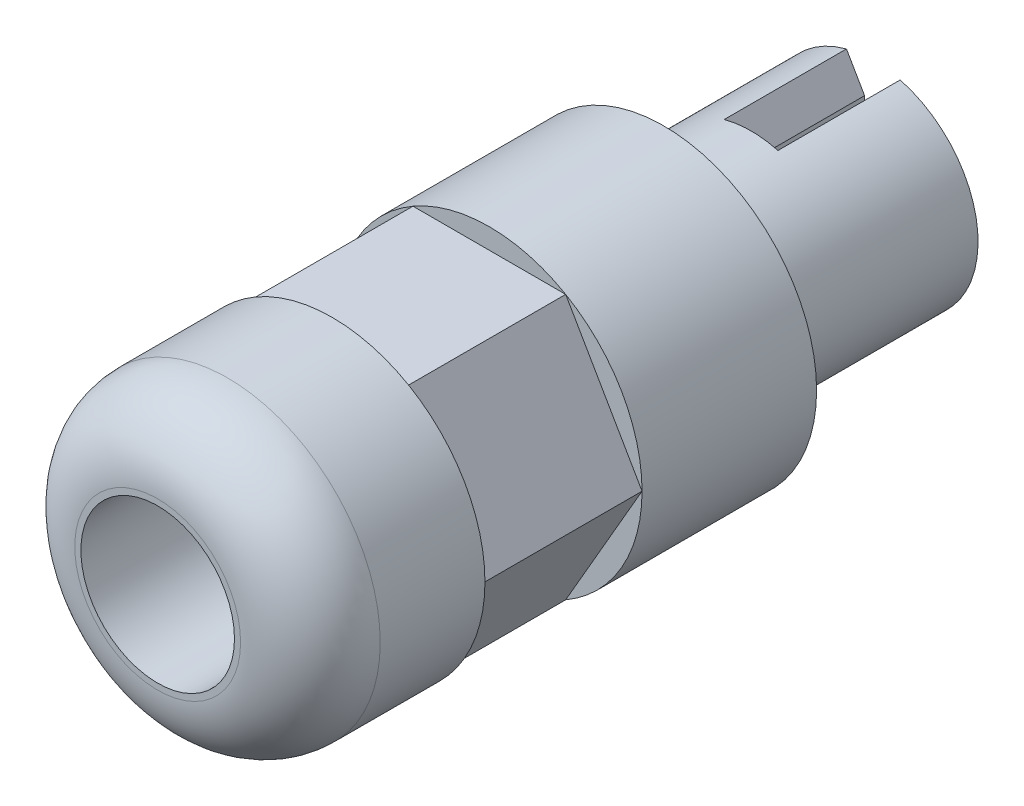
ISO-10303-21;
HEADER;
FILE_DESCRIPTION(('STEP AP214'),'2;1');
FILE_NAME('part.step','',(''),(''),'','','');
FILE_SCHEMA(('AUTOMOTIVE_DESIGN { 1 0 10303 214 1 1 1 1 }'));
ENDSEC;
DATA;
#1=APPLICATION_CONTEXT('core data for automotive mechanical design processes');
#2=APPLICATION_PROTOCOL_DEFINITION('international standard','automotive_design',2000,#1);
#3=PRODUCT_CONTEXT('',#1,'mechanical');
#4=PRODUCT('Part','Part','',(#3));
#5=PRODUCT_RELATED_PRODUCT_CATEGORY('part','',(#4));
#6=PRODUCT_DEFINITION_FORMATION('','',#4);
#7=PRODUCT_DEFINITION_CONTEXT('part definition',#1,'design');
#8=PRODUCT_DEFINITION('design','',#6,#7);
#9=PRODUCT_DEFINITION_SHAPE('','',#8);
#10=(LENGTH_UNIT() NAMED_UNIT(*) SI_UNIT(.MILLI.,.METRE.));
#11=(NAMED_UNIT(*) PLANE_ANGLE_UNIT() SI_UNIT($,.RADIAN.));
#12=(NAMED_UNIT(*) SI_UNIT($,.STERADIAN.) SOLID_ANGLE_UNIT());
#13=UNCERTAINTY_MEASURE_WITH_UNIT(LENGTH_MEASURE(1.E-05),#10,'distance_accuracy_value','');
#14=(GEOMETRIC_REPRESENTATION_CONTEXT(3) GLOBAL_UNCERTAINTY_ASSIGNED_CONTEXT((#13)) GLOBAL_UNIT_ASSIGNED_CONTEXT((#10,
#11,#12)) REPRESENTATION_CONTEXT('',''));
#15=CARTESIAN_POINT('',(0.,0.,0.));
#16=DIRECTION('',(0.,0.,1.));
#17=DIRECTION('',(1.,0.,0.));
#18=AXIS2_PLACEMENT_3D('',#15,#16,#17);
#19=CARTESIAN_POINT('',(0.,0.,0.));
#20=DIRECTION('',(0.,0.,1.));
#21=DIRECTION('',(1.,0.,0.));
#22=AXIS2_PLACEMENT_3D('',#19,#20,#21);
#23=PLANE('',#22);
#24=CARTESIAN_POINT('',(2.5,0.,0.));
#25=DIRECTION('',(0.,0.,1.));
#26=DIRECTION('',(1.,0.,0.));
#27=AXIS2_PLACEMENT_3D('',#24,#25,#26);
#28=CIRCLE('',#27,1.20000000000001);
#29=CARTESIAN_POINT('',(3.70000000000001,0.,0.));
#30=VERTEX_POINT('',#29);
#31=EDGE_CURVE('E11',#30,#30,#28,.T.);
#32=ORIENTED_EDGE('',*,*,#31,.T.);
#33=EDGE_LOOP('',(#32));
#34=FACE_BOUND('',#33,.T.);
#35=CARTESIAN_POINT('',(0.,0.,0.));
#36=DIRECTION('',(0.,0.,1.));
#37=DIRECTION('',(1.,0.,0.));
#38=AXIS2_PLACEMENT_3D('',#35,#36,#37);
#39=CIRCLE('',#38,6.);
#40=CARTESIAN_POINT('',(0.499999999999999,-5.9791303715507,0.));
#41=VERTEX_POINT('',#40);
#42=CARTESIAN_POINT('',(1.53883208058322,5.79930994410265,0.));
#43=VERTEX_POINT('',#42);
#44=EDGE_CURVE('E223',#41,#43,#39,.T.);
#45=ORIENTED_EDGE('',*,*,#44,.F.);
#46=DIRECTION('',(0.,-1.,0.));
#47=VECTOR('',#46,1.);
#48=CARTESIAN_POINT('',(0.499999999999999,-5.9791303715507,0.));
#49=LINE('',#48,#47);
#50=CARTESIAN_POINT('',(0.499999999999999,4.,0.));
#51=VERTEX_POINT('',#50);
#52=EDGE_CURVE('E139',#51,#41,#49,.T.);
#53=ORIENTED_EDGE('',*,*,#52,.F.);
#54=DIRECTION('',(-0.499999999999995,-0.866025403784441,0.));
#55=VECTOR('',#54,1.);
#56=CARTESIAN_POINT('',(0.499999999999999,4.,0.));
#57=LINE('',#56,#55);
#58=EDGE_CURVE('E289',#43,#51,#57,.T.);
#59=ORIENTED_EDGE('',*,*,#58,.F.);
#60=EDGE_LOOP('',(#45,#53,#59));
#61=FACE_BOUND('',#60,.T.);
#62=ADVANCED_FACE('F32',(#34,#61),#23,.F.);
#63=CARTESIAN_POINT('',(0.,0.,22.));
#64=DIRECTION('',(0.,0.,1.));
#65=DIRECTION('',(1.,0.,0.));
#66=AXIS2_PLACEMENT_3D('',#63,#64,#65);
#67=PLANE('',#66);
#68=DIRECTION('',(-0.5,0.866025403784438,0.));
#69=VECTOR('',#68,1.);
#70=CARTESIAN_POINT('',(8.75,0.,22.));
#71=LINE('',#70,#69);
#72=CARTESIAN_POINT('',(8.75,0.,22.));
#73=VERTEX_POINT('',#72);
#74=CARTESIAN_POINT('',(4.37500000000001,7.57772228311384,22.));
#75=VERTEX_POINT('',#74);
#76=EDGE_CURVE('E166',#73,#75,#71,.T.);
#77=ORIENTED_EDGE('',*,*,#76,.F.);
#78=CARTESIAN_POINT('',(0.,0.,22.));
#79=DIRECTION('',(0.,0.,1.));
#80=DIRECTION('',(1.,0.,0.));
#81=AXIS2_PLACEMENT_3D('',#78,#79,#80);
#82=CIRCLE('',#81,8.75);
#83=EDGE_CURVE('E220',#73,#75,#82,.T.);
#84=ORIENTED_EDGE('',*,*,#83,.T.);
#85=EDGE_LOOP('',(#77,#84));
#86=FACE_BOUND('',#85,.T.);
#87=ADVANCED_FACE('F259',(#86),#67,.T.);
#88=DIRECTION('',(0.5,0.866025403784439,0.));
#89=VECTOR('',#88,1.);
#90=CARTESIAN_POINT('',(4.375,-7.57772228311384,22.));
#91=LINE('',#90,#89);
#92=CARTESIAN_POINT('',(4.37500000000001,-7.57772228311384,22.));
#93=VERTEX_POINT('',#92);
#94=EDGE_CURVE('E54',#93,#73,#91,.T.);
#95=ORIENTED_EDGE('',*,*,#94,.F.);
#96=EDGE_CURVE('E225',#93,#73,#82,.T.);
#97=ORIENTED_EDGE('',*,*,#96,.T.);
#98=EDGE_LOOP('',(#95,#97));
#99=FACE_BOUND('',#98,.T.);
#100=ADVANCED_FACE('F266',(#99),#67,.T.);
#101=DIRECTION('',(1.,0.,0.));
#102=VECTOR('',#101,1.);
#103=CARTESIAN_POINT('',(-4.37499999999999,-7.57772228311384,22.));
#104=LINE('',#103,#102);
#105=CARTESIAN_POINT('',(-4.37499999999998,-7.57772228311385,22.));
#106=VERTEX_POINT('',#105);
#107=EDGE_CURVE('E198',#106,#93,#104,.T.);
#108=ORIENTED_EDGE('',*,*,#107,.F.);
#109=EDGE_CURVE('E658',#106,#93,#82,.T.);
#110=ORIENTED_EDGE('',*,*,#109,.T.);
#111=EDGE_LOOP('',(#108,#110));
#112=FACE_BOUND('',#111,.T.);
#113=ADVANCED_FACE('F597',(#112),#67,.T.);
#114=DIRECTION('',(0.5,-0.866025403784438,0.));
#115=VECTOR('',#114,1.);
#116=CARTESIAN_POINT('',(-8.74999999999999,0.,22.));
#117=LINE('',#116,#115);
#118=CARTESIAN_POINT('',(-8.75,0.,22.));
#119=VERTEX_POINT('',#118);
#120=EDGE_CURVE('E195',#119,#106,#117,.T.);
#121=ORIENTED_EDGE('',*,*,#120,.F.);
#122=EDGE_CURVE('E663',#119,#106,#82,.T.);
#123=ORIENTED_EDGE('',*,*,#122,.T.);
#124=EDGE_LOOP('',(#121,#123));
#125=FACE_BOUND('',#124,.T.);
#126=ADVANCED_FACE('F589',(#125),#67,.T.);
#127=DIRECTION('',(-0.5,-0.866025403784439,0.));
#128=VECTOR('',#127,1.);
#129=CARTESIAN_POINT('',(-4.375,7.57772228311383,22.));
#130=LINE('',#129,#128);
#131=CARTESIAN_POINT('',(-4.375,7.57772228311383,22.));
#132=VERTEX_POINT('',#131);
#133=EDGE_CURVE('E192',#132,#119,#130,.T.);
#134=ORIENTED_EDGE('',*,*,#133,.F.);
#135=EDGE_CURVE('E665',#132,#119,#82,.T.);
#136=ORIENTED_EDGE('',*,*,#135,.T.);
#137=EDGE_LOOP('',(#134,#136));
#138=FACE_BOUND('',#137,.T.);
#139=ADVANCED_FACE('F281',(#138),#67,.T.);
#140=CARTESIAN_POINT('',(0.,0.,12.));
#141=DIRECTION('',(0.,0.,-1.));
#142=DIRECTION('',(-1.,0.,0.));
#143=AXIS2_PLACEMENT_3D('',#140,#141,#142);
#144=CYLINDRICAL_SURFACE('',#143,6.);
#145=ORIENTED_EDGE('',*,*,#44,.T.);
#146=DIRECTION('',(0.,0.,-1.));
#147=VECTOR('',#146,1.);
#148=CARTESIAN_POINT('',(1.53883208058322,5.79930994410265,7.));
#149=LINE('',#148,#147);
#150=CARTESIAN_POINT('',(1.53883208058322,5.79930994410265,7.));
#151=VERTEX_POINT('',#150);
#152=EDGE_CURVE('E302',#151,#43,#149,.T.);
#153=ORIENTED_EDGE('',*,*,#152,.F.);
#154=CARTESIAN_POINT('',(0.,0.,7.));
#155=DIRECTION('',(0.,0.,-1.));
#156=DIRECTION('',(-1.,0.,0.));
#157=AXIS2_PLACEMENT_3D('',#154,#155,#156);
#158=CIRCLE('',#157,6.);
#159=CARTESIAN_POINT('',(-1.53883208058322,5.79930994410265,7.));
#160=VERTEX_POINT('',#159);
#161=EDGE_CURVE('E306',#160,#151,#158,.T.);
#162=ORIENTED_EDGE('',*,*,#161,.F.);
#163=DIRECTION('',(0.,0.,-1.));
#164=VECTOR('',#163,1.);
#165=CARTESIAN_POINT('',(-1.53883208058322,5.79930994410265,7.));
#166=LINE('',#165,#164);
#167=CARTESIAN_POINT('',(-1.53883208058322,5.79930994410265,0.));
#168=VERTEX_POINT('',#167);
#169=EDGE_CURVE('E149',#160,#168,#166,.T.);
#170=ORIENTED_EDGE('',*,*,#169,.T.);
#171=CARTESIAN_POINT('',(-0.499999999999999,-5.9791303715507,0.));
#172=VERTEX_POINT('',#171);
#173=EDGE_CURVE('E147',#168,#172,#39,.T.);
#174=ORIENTED_EDGE('',*,*,#173,.T.);
#175=DIRECTION('',(0.,0.,-1.));
#176=VECTOR('',#175,1.);
#177=CARTESIAN_POINT('',(-0.499999999999999,-5.97913037155069,7.));
#178=LINE('',#177,#176);
#179=CARTESIAN_POINT('',(-0.499999999999999,-5.97913037155069,7.));
#180=VERTEX_POINT('',#179);
#181=EDGE_CURVE('E47',#180,#172,#178,.T.);
#182=ORIENTED_EDGE('',*,*,#181,.F.);
#183=CARTESIAN_POINT('',(0.,0.,7.));
#184=DIRECTION('',(0.,0.,-1.));
#185=DIRECTION('',(-1.,0.,0.));
#186=AXIS2_PLACEMENT_3D('',#183,#184,#185);
#187=CIRCLE('',#186,6.);
#188=CARTESIAN_POINT('',(0.499999999999999,-5.9791303715507,7.));
#189=VERTEX_POINT('',#188);
#190=EDGE_CURVE('E129',#189,#180,#187,.T.);
#191=ORIENTED_EDGE('',*,*,#190,.F.);
#192=DIRECTION('',(0.,0.,-1.));
#193=VECTOR('',#192,1.);
#194=CARTESIAN_POINT('',(0.499999999999999,-5.9791303715507,7.));
#195=LINE('',#194,#193);
#196=EDGE_CURVE('E162',#189,#41,#195,.T.);
#197=ORIENTED_EDGE('',*,*,#196,.T.);
#198=EDGE_LOOP('',(#145,#153,#162,#170,#174,#182,#191,#197));
#199=FACE_BOUND('',#198,.T.);
#200=CARTESIAN_POINT('',(0.,0.,12.));
#201=DIRECTION('',(0.,0.,1.));
#202=DIRECTION('',(1.,0.,0.));
#203=AXIS2_PLACEMENT_3D('',#200,#201,#202);
#204=CIRCLE('',#203,6.);
#205=CARTESIAN_POINT('',(6.,0.,12.));
#206=VERTEX_POINT('',#205);
#207=EDGE_CURVE('E228',#206,#206,#204,.T.);
#208=ORIENTED_EDGE('',*,*,#207,.F.);
#209=EDGE_LOOP('',(#208));
#210=FACE_BOUND('',#209,.T.);
#211=ADVANCED_FACE('F143',(#199,#210),#144,.T.);
#212=CARTESIAN_POINT('',(-2.5,0.,0.));
#213=DIRECTION('',(0.,0.,1.));
#214=DIRECTION('',(1.,0.,0.));
#215=AXIS2_PLACEMENT_3D('',#212,#213,#214);
#216=CIRCLE('',#215,1.20000000000001);
#217=CARTESIAN_POINT('',(-1.29999999999999,0.,0.));
#218=VERTEX_POINT('',#217);
#219=EDGE_CURVE('E241',#218,#218,#216,.T.);
#220=ORIENTED_EDGE('',*,*,#219,.T.);
#221=EDGE_LOOP('',(#220));
#222=FACE_BOUND('',#221,.T.);
#223=ORIENTED_EDGE('',*,*,#173,.F.);
#224=DIRECTION('',(-0.499999999999996,0.866025403784441,0.));
#225=VECTOR('',#224,1.);
#226=CARTESIAN_POINT('',(-0.499999999999999,4.,0.));
#227=LINE('',#226,#225);
#228=CARTESIAN_POINT('',(-0.499999999999999,4.,0.));
#229=VERTEX_POINT('',#228);
#230=EDGE_CURVE('E285',#229,#168,#227,.T.);
#231=ORIENTED_EDGE('',*,*,#230,.F.);
#232=DIRECTION('',(0.,1.,0.));
#233=VECTOR('',#232,1.);
#234=CARTESIAN_POINT('',(-0.499999999999999,-5.97913037155069,0.));
#235=LINE('',#234,#233);
#236=EDGE_CURVE('E286',#172,#229,#235,.T.);
#237=ORIENTED_EDGE('',*,*,#236,.F.);
#238=EDGE_LOOP('',(#223,#231,#237));
#239=FACE_BOUND('',#238,.T.);
#240=ADVANCED_FACE('F262',(#222,#239),#23,.F.);
#241=CARTESIAN_POINT('',(0.,0.,22.));
#242=DIRECTION('',(0.,0.,-1.));
#243=DIRECTION('',(-1.,0.,0.));
#244=AXIS2_PLACEMENT_3D('',#241,#242,#243);
#245=CYLINDRICAL_SURFACE('',#244,8.75);
#246=ORIENTED_EDGE('',*,*,#83,.F.);
#247=ORIENTED_EDGE('',*,*,#96,.F.);
#248=ORIENTED_EDGE('',*,*,#109,.F.);
#249=ORIENTED_EDGE('',*,*,#122,.F.);
#250=ORIENTED_EDGE('',*,*,#135,.F.);
#251=EDGE_CURVE('E224',#75,#132,#82,.T.);
#252=ORIENTED_EDGE('',*,*,#251,.F.);
#253=EDGE_LOOP('',(#246,#247,#248,#249,#250,#252));
#254=FACE_BOUND('',#253,.T.);
#255=CARTESIAN_POINT('',(0.,0.,12.));
#256=DIRECTION('',(0.,0.,1.));
#257=DIRECTION('',(1.,0.,0.));
#258=AXIS2_PLACEMENT_3D('',#255,#256,#257);
#259=CIRCLE('',#258,8.75);
#260=CARTESIAN_POINT('',(8.75,0.,12.));
#261=VERTEX_POINT('',#260);
#262=EDGE_CURVE('E219',#261,#261,#259,.T.);
#263=ORIENTED_EDGE('',*,*,#262,.T.);
#264=EDGE_LOOP('',(#263));
#265=FACE_BOUND('',#264,.T.);
#266=ADVANCED_FACE('F274',(#254,#265),#245,.T.);
#267=DIRECTION('',(-1.,0.,0.));
#268=VECTOR('',#267,1.);
#269=CARTESIAN_POINT('',(4.375,7.57772228311384,22.));
#270=LINE('',#269,#268);
#271=EDGE_CURVE('E189',#75,#132,#270,.T.);
#272=ORIENTED_EDGE('',*,*,#271,.F.);
#273=ORIENTED_EDGE('',*,*,#251,.T.);
#274=EDGE_LOOP('',(#272,#273));
#275=FACE_BOUND('',#274,.T.);
#276=ADVANCED_FACE('F269',(#275),#67,.T.);
#277=CARTESIAN_POINT('',(0.,0.,12.));
#278=DIRECTION('',(0.,0.,1.));
#279=DIRECTION('',(1.,0.,0.));
#280=AXIS2_PLACEMENT_3D('',#277,#278,#279);
#281=PLANE('',#280);
#282=ORIENTED_EDGE('',*,*,#207,.T.);
#283=EDGE_LOOP('',(#282));
#284=FACE_BOUND('',#283,.T.);
#285=ORIENTED_EDGE('',*,*,#262,.F.);
#286=EDGE_LOOP('',(#285));
#287=FACE_BOUND('',#286,.T.);
#288=ADVANCED_FACE('F375',(#284,#287),#281,.F.);
#289=CARTESIAN_POINT('',(8.75,0.,31.));
#290=DIRECTION('',(-0.866025403784438,-0.5,0.));
#291=DIRECTION('',(0.5,-0.866025403784438,0.));
#292=AXIS2_PLACEMENT_3D('',#289,#290,#291);
#293=PLANE('',#292);
#294=ORIENTED_EDGE('',*,*,#76,.T.);
#295=DIRECTION('',(0.,0.,-1.));
#296=VECTOR('',#295,1.);
#297=CARTESIAN_POINT('',(4.375,7.57772228311384,31.));
#298=LINE('',#297,#296);
#299=CARTESIAN_POINT('',(4.375,7.57772228311384,31.));
#300=VERTEX_POINT('',#299);
#301=EDGE_CURVE('E216',#300,#75,#298,.T.);
#302=ORIENTED_EDGE('',*,*,#301,.F.);
#303=DIRECTION('',(-0.5,0.866025403784438,0.));
#304=VECTOR('',#303,1.);
#305=CARTESIAN_POINT('',(8.75,0.,31.));
#306=LINE('',#305,#304);
#307=CARTESIAN_POINT('',(8.75,0.,31.));
#308=VERTEX_POINT('',#307);
#309=EDGE_CURVE('E168',#308,#300,#306,.T.);
#310=ORIENTED_EDGE('',*,*,#309,.F.);
#311=DIRECTION('',(0.,0.,-1.));
#312=VECTOR('',#311,1.);
#313=CARTESIAN_POINT('',(8.75,0.,31.));
#314=LINE('',#313,#312);
#315=EDGE_CURVE('E186',#308,#73,#314,.T.);
#316=ORIENTED_EDGE('',*,*,#315,.T.);
#317=EDGE_LOOP('',(#294,#302,#310,#316));
#318=FACE_BOUND('',#317,.T.);
#319=ADVANCED_FACE('F372',(#318),#293,.F.);
#320=CARTESIAN_POINT('',(4.375,7.57772228311384,31.));
#321=DIRECTION('',(0.,-1.,0.));
#322=DIRECTION('',(1.,0.,0.));
#323=AXIS2_PLACEMENT_3D('',#320,#321,#322);
#324=PLANE('',#323);
#325=ORIENTED_EDGE('',*,*,#271,.T.);
#326=DIRECTION('',(0.,0.,-1.));
#327=VECTOR('',#326,1.);
#328=CARTESIAN_POINT('',(-4.375,7.57772228311383,31.));
#329=LINE('',#328,#327);
#330=CARTESIAN_POINT('',(-4.375,7.57772228311383,31.));
#331=VERTEX_POINT('',#330);
#332=EDGE_CURVE('E213',#331,#132,#329,.T.);
#333=ORIENTED_EDGE('',*,*,#332,.F.);
#334=DIRECTION('',(-1.,0.,0.));
#335=VECTOR('',#334,1.);
#336=CARTESIAN_POINT('',(4.375,7.57772228311384,31.));
#337=LINE('',#336,#335);
#338=EDGE_CURVE('E171',#300,#331,#337,.T.);
#339=ORIENTED_EDGE('',*,*,#338,.F.);
#340=ORIENTED_EDGE('',*,*,#301,.T.);
#341=EDGE_LOOP('',(#325,#333,#339,#340));
#342=FACE_BOUND('',#341,.T.);
#343=ADVANCED_FACE('F368',(#342),#324,.F.);
#344=CARTESIAN_POINT('',(-4.375,7.57772228311383,31.));
#345=DIRECTION('',(0.866025403784439,-0.5,0.));
#346=DIRECTION('',(0.5,0.866025403784439,0.));
#347=AXIS2_PLACEMENT_3D('',#344,#345,#346);
#348=PLANE('',#347);
#349=ORIENTED_EDGE('',*,*,#133,.T.);
#350=DIRECTION('',(0.,0.,-1.));
#351=VECTOR('',#350,1.);
#352=CARTESIAN_POINT('',(-8.74999999999999,0.,31.));
#353=LINE('',#352,#351);
#354=CARTESIAN_POINT('',(-8.74999999999999,0.,31.));
#355=VERTEX_POINT('',#354);
#356=EDGE_CURVE('E210',#355,#119,#353,.T.);
#357=ORIENTED_EDGE('',*,*,#356,.F.);
#358=DIRECTION('',(-0.5,-0.866025403784439,0.));
#359=VECTOR('',#358,1.);
#360=CARTESIAN_POINT('',(-4.375,7.57772228311383,31.));
#361=LINE('',#360,#359);
#362=EDGE_CURVE('E174',#331,#355,#361,.T.);
#363=ORIENTED_EDGE('',*,*,#362,.F.);
#364=ORIENTED_EDGE('',*,*,#332,.T.);
#365=EDGE_LOOP('',(#349,#357,#363,#364));
#366=FACE_BOUND('',#365,.T.);
#367=ADVANCED_FACE('F364',(#366),#348,.F.);
#368=CARTESIAN_POINT('',(-8.74999999999999,0.,31.));
#369=DIRECTION('',(0.866025403784438,0.5,0.));
#370=DIRECTION('',(-0.500000000000001,0.866025403784438,0.));
#371=AXIS2_PLACEMENT_3D('',#368,#369,#370);
#372=PLANE('',#371);
#373=ORIENTED_EDGE('',*,*,#120,.T.);
#374=DIRECTION('',(0.,0.,-1.));
#375=VECTOR('',#374,1.);
#376=CARTESIAN_POINT('',(-4.37499999999999,-7.57772228311384,31.));
#377=LINE('',#376,#375);
#378=CARTESIAN_POINT('',(-4.37499999999999,-7.57772228311384,31.));
#379=VERTEX_POINT('',#378);
#380=EDGE_CURVE('E207',#379,#106,#377,.T.);
#381=ORIENTED_EDGE('',*,*,#380,.F.);
#382=DIRECTION('',(0.5,-0.866025403784438,0.));
#383=VECTOR('',#382,1.);
#384=CARTESIAN_POINT('',(-8.74999999999999,0.,31.));
#385=LINE('',#384,#383);
#386=EDGE_CURVE('E177',#355,#379,#385,.T.);
#387=ORIENTED_EDGE('',*,*,#386,.F.);
#388=ORIENTED_EDGE('',*,*,#356,.T.);
#389=EDGE_LOOP('',(#373,#381,#387,#388));
#390=FACE_BOUND('',#389,.T.);
#391=ADVANCED_FACE('F360',(#390),#372,.F.);
#392=CARTESIAN_POINT('',(-4.37499999999999,-7.57772228311384,31.));
#393=DIRECTION('',(0.,1.,0.));
#394=DIRECTION('',(-1.,0.,0.));
#395=AXIS2_PLACEMENT_3D('',#392,#393,#394);
#396=PLANE('',#395);
#397=ORIENTED_EDGE('',*,*,#107,.T.);
#398=DIRECTION('',(0.,0.,-1.));
#399=VECTOR('',#398,1.);
#400=CARTESIAN_POINT('',(4.375,-7.57772228311384,31.));
#401=LINE('',#400,#399);
#402=CARTESIAN_POINT('',(4.375,-7.57772228311384,31.));
#403=VERTEX_POINT('',#402);
#404=EDGE_CURVE('E204',#403,#93,#401,.T.);
#405=ORIENTED_EDGE('',*,*,#404,.F.);
#406=DIRECTION('',(1.,0.,0.));
#407=VECTOR('',#406,1.);
#408=CARTESIAN_POINT('',(-4.37499999999999,-7.57772228311384,31.));
#409=LINE('',#408,#407);
#410=EDGE_CURVE('E180',#379,#403,#409,.T.);
#411=ORIENTED_EDGE('',*,*,#410,.F.);
#412=ORIENTED_EDGE('',*,*,#380,.T.);
#413=EDGE_LOOP('',(#397,#405,#411,#412));
#414=FACE_BOUND('',#413,.T.);
#415=ADVANCED_FACE('F356',(#414),#396,.F.);
#416=CARTESIAN_POINT('',(4.375,-7.57772228311384,31.));
#417=DIRECTION('',(-0.866025403784439,0.5,0.));
#418=DIRECTION('',(-0.5,-0.866025403784439,0.));
#419=AXIS2_PLACEMENT_3D('',#416,#417,#418);
#420=PLANE('',#419);
#421=ORIENTED_EDGE('',*,*,#94,.T.);
#422=ORIENTED_EDGE('',*,*,#315,.F.);
#423=DIRECTION('',(0.5,0.866025403784439,0.));
#424=VECTOR('',#423,1.);
#425=CARTESIAN_POINT('',(4.375,-7.57772228311384,31.));
#426=LINE('',#425,#424);
#427=EDGE_CURVE('E183',#403,#308,#426,.T.);
#428=ORIENTED_EDGE('',*,*,#427,.F.);
#429=ORIENTED_EDGE('',*,*,#404,.T.);
#430=EDGE_LOOP('',(#421,#422,#428,#429));
#431=FACE_BOUND('',#430,.T.);
#432=ADVANCED_FACE('F353',(#431),#420,.F.);
#433=CARTESIAN_POINT('',(0.,0.,31.));
#434=DIRECTION('',(0.,0.,1.));
#435=DIRECTION('',(1.,0.,0.));
#436=AXIS2_PLACEMENT_3D('',#433,#434,#435);
#437=PLANE('',#436);
#438=CARTESIAN_POINT('',(0.,0.,31.));
#439=DIRECTION('',(0.,0.,1.));
#440=DIRECTION('',(1.,0.,0.));
#441=AXIS2_PLACEMENT_3D('',#438,#439,#440);
#442=CIRCLE('',#441,8.75);
#443=EDGE_CURVE('E163',#308,#300,#442,.T.);
#444=ORIENTED_EDGE('',*,*,#443,.F.);
#445=ORIENTED_EDGE('',*,*,#309,.T.);
#446=EDGE_LOOP('',(#444,#445));
#447=FACE_BOUND('',#446,.T.);
#448=ADVANCED_FACE('F348',(#447),#437,.F.);
#449=EDGE_CURVE('E167',#300,#331,#442,.T.);
#450=ORIENTED_EDGE('',*,*,#449,.F.);
#451=ORIENTED_EDGE('',*,*,#338,.T.);
#452=EDGE_LOOP('',(#450,#451));
#453=FACE_BOUND('',#452,.T.);
#454=ADVANCED_FACE('F421',(#453),#437,.F.);
#455=EDGE_CURVE('E681',#331,#355,#442,.T.);
#456=ORIENTED_EDGE('',*,*,#455,.F.);
#457=ORIENTED_EDGE('',*,*,#362,.T.);
#458=EDGE_LOOP('',(#456,#457));
#459=FACE_BOUND('',#458,.T.);
#460=ADVANCED_FACE('F428',(#459),#437,.F.);
#461=EDGE_CURVE('E673',#355,#379,#442,.T.);
#462=ORIENTED_EDGE('',*,*,#461,.F.);
#463=ORIENTED_EDGE('',*,*,#386,.T.);
#464=EDGE_LOOP('',(#462,#463));
#465=FACE_BOUND('',#464,.T.);
#466=ADVANCED_FACE('F435',(#465),#437,.F.);
#467=EDGE_CURVE('E676',#379,#403,#442,.T.);
#468=ORIENTED_EDGE('',*,*,#467,.F.);
#469=ORIENTED_EDGE('',*,*,#410,.T.);
#470=EDGE_LOOP('',(#468,#469));
#471=FACE_BOUND('',#470,.T.);
#472=ADVANCED_FACE('F349',(#471),#437,.F.);
#473=CARTESIAN_POINT('',(0.,0.,41.));
#474=DIRECTION('',(0.,0.,-1.));
#475=DIRECTION('',(-1.,0.,0.));
#476=AXIS2_PLACEMENT_3D('',#473,#474,#475);
#477=CYLINDRICAL_SURFACE('',#476,8.75);
#478=CARTESIAN_POINT('',(0.,0.,37.));
#479=DIRECTION('',(0.,0.,1.));
#480=DIRECTION('',(1.,0.,0.));
#481=AXIS2_PLACEMENT_3D('',#478,#479,#480);
#482=CIRCLE('',#481,8.75);
#483=CARTESIAN_POINT('',(8.75,0.,37.));
#484=VERTEX_POINT('',#483);
#485=EDGE_CURVE('E235',#484,#484,#482,.F.);
#486=ORIENTED_EDGE('',*,*,#485,.T.);
#487=EDGE_LOOP('',(#486));
#488=FACE_BOUND('',#487,.T.);
#489=ORIENTED_EDGE('',*,*,#443,.T.);
#490=ORIENTED_EDGE('',*,*,#449,.T.);
#491=ORIENTED_EDGE('',*,*,#455,.T.);
#492=ORIENTED_EDGE('',*,*,#461,.T.);
#493=ORIENTED_EDGE('',*,*,#467,.T.);
#494=EDGE_CURVE('E158',#403,#308,#442,.T.);
#495=ORIENTED_EDGE('',*,*,#494,.T.);
#496=EDGE_LOOP('',(#489,#490,#491,#492,#493,#495));
#497=FACE_BOUND('',#496,.T.);
#498=ADVANCED_FACE('F343',(#488,#497),#477,.T.);
#499=CARTESIAN_POINT('',(0.,0.,41.));
#500=DIRECTION('',(0.,0.,1.));
#501=DIRECTION('',(1.,0.,0.));
#502=AXIS2_PLACEMENT_3D('',#499,#500,#501);
#503=PLANE('',#502);
#504=CARTESIAN_POINT('',(0.,0.,41.));
#505=DIRECTION('',(0.,0.,1.));
#506=DIRECTION('',(1.,0.,0.));
#507=AXIS2_PLACEMENT_3D('',#504,#505,#506);
#508=CIRCLE('',#507,4.4);
#509=CARTESIAN_POINT('',(4.4,0.,41.));
#510=VERTEX_POINT('',#509);
#511=EDGE_CURVE('E159',#510,#510,#508,.T.);
#512=ORIENTED_EDGE('',*,*,#511,.F.);
#513=EDGE_LOOP('',(#512));
#514=FACE_BOUND('',#513,.T.);
#515=CARTESIAN_POINT('',(0.,0.,41.));
#516=DIRECTION('',(0.,0.,1.));
#517=DIRECTION('',(1.,0.,0.));
#518=AXIS2_PLACEMENT_3D('',#515,#516,#517);
#519=CIRCLE('',#518,4.75);
#520=CARTESIAN_POINT('',(4.75,0.,41.));
#521=VERTEX_POINT('',#520);
#522=EDGE_CURVE('E231',#521,#521,#519,.T.);
#523=ORIENTED_EDGE('',*,*,#522,.T.);
#524=EDGE_LOOP('',(#523));
#525=FACE_BOUND('',#524,.T.);
#526=ADVANCED_FACE('F339',(#514,#525),#503,.T.);
#527=ORIENTED_EDGE('',*,*,#494,.F.);
#528=ORIENTED_EDGE('',*,*,#427,.T.);
#529=EDGE_LOOP('',(#527,#528));
#530=FACE_BOUND('',#529,.T.);
#531=ADVANCED_FACE('F342',(#530),#437,.F.);
#532=CARTESIAN_POINT('',(0.,0.,37.));
#533=DIRECTION('',(0.,0.,1.));
#534=DIRECTION('',(1.,0.,0.));
#535=AXIS2_PLACEMENT_3D('',#532,#533,#534);
#536=TOROIDAL_SURFACE('',#535,4.75,4.);
#537=ORIENTED_EDGE('',*,*,#485,.F.);
#538=EDGE_LOOP('',(#537));
#539=FACE_BOUND('',#538,.T.);
#540=ORIENTED_EDGE('',*,*,#522,.F.);
#541=EDGE_LOOP('',(#540));
#542=FACE_BOUND('',#541,.T.);
#543=ADVANCED_FACE('F337',(#539,#542),#536,.T.);
#544=CARTESIAN_POINT('',(0.,0.,21.));
#545=DIRECTION('',(0.,0.,1.));
#546=DIRECTION('',(1.,0.,0.));
#547=AXIS2_PLACEMENT_3D('',#544,#545,#546);
#548=CYLINDRICAL_SURFACE('',#547,4.4);
#549=CARTESIAN_POINT('',(0.,0.,21.));
#550=DIRECTION('',(0.,0.,1.));
#551=DIRECTION('',(1.,0.,0.));
#552=AXIS2_PLACEMENT_3D('',#549,#550,#551);
#553=CIRCLE('',#552,4.4);
#554=CARTESIAN_POINT('',(4.4,0.,21.));
#555=VERTEX_POINT('',#554);
#556=EDGE_CURVE('E155',#555,#555,#553,.T.);
#557=ORIENTED_EDGE('',*,*,#556,.F.);
#558=EDGE_LOOP('',(#557));
#559=FACE_BOUND('',#558,.T.);
#560=ORIENTED_EDGE('',*,*,#511,.T.);
#561=EDGE_LOOP('',(#560));
#562=FACE_BOUND('',#561,.T.);
#563=ADVANCED_FACE('F333',(#559,#562),#548,.F.);
#564=CARTESIAN_POINT('',(0.,0.,21.));
#565=DIRECTION('',(0.,0.,1.));
#566=DIRECTION('',(1.,0.,0.));
#567=AXIS2_PLACEMENT_3D('',#564,#565,#566);
#568=PLANE('',#567);
#569=ORIENTED_EDGE('',*,*,#556,.T.);
#570=EDGE_LOOP('',(#569));
#571=FACE_BOUND('',#570,.T.);
#572=ADVANCED_FACE('F325',(#571),#568,.T.);
#573=CARTESIAN_POINT('',(0.499999999999999,-5.9791303715507,7.));
#574=DIRECTION('',(1.,0.,0.));
#575=DIRECTION('',(0.,0.,-1.));
#576=AXIS2_PLACEMENT_3D('',#573,#574,#575);
#577=PLANE('',#576);
#578=ORIENTED_EDGE('',*,*,#52,.T.);
#579=ORIENTED_EDGE('',*,*,#196,.F.);
#580=DIRECTION('',(0.,-1.,0.));
#581=VECTOR('',#580,1.);
#582=CARTESIAN_POINT('',(0.499999999999999,-5.9791303715507,7.));
#583=LINE('',#582,#581);
#584=CARTESIAN_POINT('',(0.499999999999999,4.,7.));
#585=VERTEX_POINT('',#584);
#586=EDGE_CURVE('E136',#585,#189,#583,.T.);
#587=ORIENTED_EDGE('',*,*,#586,.F.);
#588=DIRECTION('',(0.,0.,-1.));
#589=VECTOR('',#588,1.);
#590=CARTESIAN_POINT('',(0.499999999999999,4.,7.));
#591=LINE('',#590,#589);
#592=EDGE_CURVE('E300',#585,#51,#591,.T.);
#593=ORIENTED_EDGE('',*,*,#592,.T.);
#594=EDGE_LOOP('',(#578,#579,#587,#593));
#595=FACE_BOUND('',#594,.T.);
#596=ADVANCED_FACE('F313',(#595),#577,.F.);
#597=CARTESIAN_POINT('',(0.499999999999999,4.,7.));
#598=DIRECTION('',(0.866025403784441,-0.499999999999995,0.));
#599=DIRECTION('',(0.499999999999995,0.866025403784441,0.));
#600=AXIS2_PLACEMENT_3D('',#597,#598,#599);
#601=PLANE('',#600);
#602=ORIENTED_EDGE('',*,*,#58,.T.);
#603=ORIENTED_EDGE('',*,*,#592,.F.);
#604=DIRECTION('',(-0.499999999999995,-0.866025403784441,0.));
#605=VECTOR('',#604,1.);
#606=CARTESIAN_POINT('',(0.499999999999999,4.,7.));
#607=LINE('',#606,#605);
#608=EDGE_CURVE('E151',#151,#585,#607,.T.);
#609=ORIENTED_EDGE('',*,*,#608,.F.);
#610=ORIENTED_EDGE('',*,*,#152,.T.);
#611=EDGE_LOOP('',(#602,#603,#609,#610));
#612=FACE_BOUND('',#611,.T.);
#613=ADVANCED_FACE('F317',(#612),#601,.F.);
#614=CARTESIAN_POINT('',(-0.499999999999999,4.,7.));
#615=DIRECTION('',(-0.866025403784441,-0.499999999999996,0.));
#616=DIRECTION('',(0.499999999999996,-0.866025403784441,0.));
#617=AXIS2_PLACEMENT_3D('',#614,#615,#616);
#618=PLANE('',#617);
#619=ORIENTED_EDGE('',*,*,#230,.T.);
#620=ORIENTED_EDGE('',*,*,#169,.F.);
#621=DIRECTION('',(-0.499999999999996,0.866025403784441,0.));
#622=VECTOR('',#621,1.);
#623=CARTESIAN_POINT('',(-0.499999999999999,4.,7.));
#624=LINE('',#623,#622);
#625=CARTESIAN_POINT('',(-0.499999999999999,4.,7.));
#626=VERTEX_POINT('',#625);
#627=EDGE_CURVE('E128',#626,#160,#624,.T.);
#628=ORIENTED_EDGE('',*,*,#627,.F.);
#629=DIRECTION('',(0.,0.,-1.));
#630=VECTOR('',#629,1.);
#631=CARTESIAN_POINT('',(-0.499999999999999,4.,7.));
#632=LINE('',#631,#630);
#633=EDGE_CURVE('E124',#626,#229,#632,.T.);
#634=ORIENTED_EDGE('',*,*,#633,.T.);
#635=EDGE_LOOP('',(#619,#620,#628,#634));
#636=FACE_BOUND('',#635,.T.);
#637=ADVANCED_FACE('F308',(#636),#618,.F.);
#638=CARTESIAN_POINT('',(-0.499999999999999,-5.97913037155069,7.));
#639=DIRECTION('',(-1.,0.,0.));
#640=DIRECTION('',(0.,0.,1.));
#641=AXIS2_PLACEMENT_3D('',#638,#639,#640);
#642=PLANE('',#641);
#643=ORIENTED_EDGE('',*,*,#236,.T.);
#644=ORIENTED_EDGE('',*,*,#633,.F.);
#645=DIRECTION('',(0.,1.,0.));
#646=VECTOR('',#645,1.);
#647=CARTESIAN_POINT('',(-0.499999999999999,-5.97913037155069,7.));
#648=LINE('',#647,#646);
#649=EDGE_CURVE('E121',#180,#626,#648,.T.);
#650=ORIENTED_EDGE('',*,*,#649,.F.);
#651=ORIENTED_EDGE('',*,*,#181,.T.);
#652=EDGE_LOOP('',(#643,#644,#650,#651));
#653=FACE_BOUND('',#652,.T.);
#654=ADVANCED_FACE('F123',(#653),#642,.F.);
#655=CARTESIAN_POINT('',(0.,0.,7.));
#656=DIRECTION('',(0.,0.,-1.));
#657=DIRECTION('',(-1.,0.,0.));
#658=AXIS2_PLACEMENT_3D('',#655,#656,#657);
#659=PLANE('',#658);
#660=ORIENTED_EDGE('',*,*,#190,.T.);
#661=ORIENTED_EDGE('',*,*,#649,.T.);
#662=ORIENTED_EDGE('',*,*,#627,.T.);
#663=ORIENTED_EDGE('',*,*,#161,.T.);
#664=ORIENTED_EDGE('',*,*,#608,.T.);
#665=ORIENTED_EDGE('',*,*,#586,.T.);
#666=EDGE_LOOP('',(#660,#661,#662,#663,#664,#665));
#667=FACE_BOUND('',#666,.T.);
#668=ADVANCED_FACE('F133',(#667),#659,.T.);
#669=CARTESIAN_POINT('',(-2.5,0.,7.));
#670=DIRECTION('',(0.,0.,-1.));
#671=DIRECTION('',(-1.,0.,0.));
#672=AXIS2_PLACEMENT_3D('',#669,#670,#671);
#673=CYLINDRICAL_SURFACE('',#672,1.);
#674=CARTESIAN_POINT('',(-2.5,0.,0.200000000000003));
#675=DIRECTION('',(0.,0.,1.));
#676=DIRECTION('',(1.,0.,0.));
#677=AXIS2_PLACEMENT_3D('',#674,#675,#676);
#678=CIRCLE('',#677,1.);
#679=CARTESIAN_POINT('',(-1.5,0.,0.200000000000003));
#680=VERTEX_POINT('',#679);
#681=EDGE_CURVE('E238',#680,#680,#678,.F.);
#682=ORIENTED_EDGE('',*,*,#681,.T.);
#683=EDGE_LOOP('',(#682));
#684=FACE_BOUND('',#683,.T.);
#685=CARTESIAN_POINT('',(-2.5,0.,7.));
#686=DIRECTION('',(0.,0.,-1.));
#687=DIRECTION('',(-1.,0.,0.));
#688=AXIS2_PLACEMENT_3D('',#685,#686,#687);
#689=CIRCLE('',#688,1.);
#690=CARTESIAN_POINT('',(-3.5,0.,7.));
#691=VERTEX_POINT('',#690);
#692=EDGE_CURVE('E292',#691,#691,#689,.T.);
#693=ORIENTED_EDGE('',*,*,#692,.F.);
#694=EDGE_LOOP('',(#693));
#695=FACE_BOUND('',#694,.T.);
#696=ADVANCED_FACE('F508',(#684,#695),#673,.F.);
#697=CARTESIAN_POINT('',(-2.5,0.,7.));
#698=DIRECTION('',(0.,0.,-1.));
#699=DIRECTION('',(-1.,0.,0.));
#700=AXIS2_PLACEMENT_3D('',#697,#698,#699);
#701=PLANE('',#700);
#702=ORIENTED_EDGE('',*,*,#692,.T.);
#703=EDGE_LOOP('',(#702));
#704=FACE_BOUND('',#703,.T.);
#705=ADVANCED_FACE('F514',(#704),#701,.T.);
#706=CARTESIAN_POINT('',(2.5,0.,7.));
#707=DIRECTION('',(0.,0.,-1.));
#708=DIRECTION('',(-1.,0.,0.));
#709=AXIS2_PLACEMENT_3D('',#706,#707,#708);
#710=CYLINDRICAL_SURFACE('',#709,1.);
#711=CARTESIAN_POINT('',(2.5,0.,0.200000000000003));
#712=DIRECTION('',(0.,0.,1.));
#713=DIRECTION('',(1.,0.,0.));
#714=AXIS2_PLACEMENT_3D('',#711,#712,#713);
#715=CIRCLE('',#714,1.);
#716=CARTESIAN_POINT('',(3.5,0.,0.200000000000003));
#717=VERTEX_POINT('',#716);
#718=EDGE_CURVE('E40',#717,#717,#715,.F.);
#719=ORIENTED_EDGE('',*,*,#718,.T.);
#720=EDGE_LOOP('',(#719));
#721=FACE_BOUND('',#720,.T.);
#722=CARTESIAN_POINT('',(2.5,0.,7.));
#723=DIRECTION('',(0.,0.,-1.));
#724=DIRECTION('',(-1.,0.,0.));
#725=AXIS2_PLACEMENT_3D('',#722,#723,#724);
#726=CIRCLE('',#725,1.);
#727=CARTESIAN_POINT('',(1.5,0.,7.));
#728=VERTEX_POINT('',#727);
#729=EDGE_CURVE('E287',#728,#728,#726,.T.);
#730=ORIENTED_EDGE('',*,*,#729,.F.);
#731=EDGE_LOOP('',(#730));
#732=FACE_BOUND('',#731,.T.);
#733=ADVANCED_FACE('F246',(#721,#732),#710,.F.);
#734=CARTESIAN_POINT('',(2.5,0.,7.));
#735=DIRECTION('',(0.,0.,-1.));
#736=DIRECTION('',(-1.,0.,0.));
#737=AXIS2_PLACEMENT_3D('',#734,#735,#736);
#738=PLANE('',#737);
#739=ORIENTED_EDGE('',*,*,#729,.T.);
#740=EDGE_LOOP('',(#739));
#741=FACE_BOUND('',#740,.T.);
#742=ADVANCED_FACE('F255',(#741),#738,.T.);
#743=CARTESIAN_POINT('',(-2.5,0.,0.200000000000003));
#744=DIRECTION('',(0.,0.,-1.));
#745=DIRECTION('',(-1.,0.,0.));
#746=AXIS2_PLACEMENT_3D('',#743,#744,#745);
#747=CONICAL_SURFACE('',#746,1.,0.785398163397456);
#748=ORIENTED_EDGE('',*,*,#219,.F.);
#749=EDGE_LOOP('',(#748));
#750=FACE_BOUND('',#749,.T.);
#751=ORIENTED_EDGE('',*,*,#681,.F.);
#752=EDGE_LOOP('',(#751));
#753=FACE_BOUND('',#752,.T.);
#754=ADVANCED_FACE('F250',(#750,#753),#747,.F.);
#755=CARTESIAN_POINT('',(2.5,0.,0.200000000000003));
#756=DIRECTION('',(0.,0.,-1.));
#757=DIRECTION('',(-1.,0.,0.));
#758=AXIS2_PLACEMENT_3D('',#755,#756,#757);
#759=CONICAL_SURFACE('',#758,1.,0.785398163397457);
#760=ORIENTED_EDGE('',*,*,#31,.F.);
#761=EDGE_LOOP('',(#760));
#762=FACE_BOUND('',#761,.T.);
#763=ORIENTED_EDGE('',*,*,#718,.F.);
#764=EDGE_LOOP('',(#763));
#765=FACE_BOUND('',#764,.T.);
#766=ADVANCED_FACE('F34',(#762,#765),#759,.F.);
#767=CLOSED_SHELL('',(#62,#87,#100,#113,#126,#139,#211,#240,#266,#276,#288,#319,#343,#367,#391,
#415,#432,#448,#454,#460,#466,#472,#498,#526,#531,#543,#563,#572,#596,#613,#637,#654,#668,#696,
#705,#733,#742,#754,#766));
#768=MANIFOLD_SOLID_BREP('B2',#767);
#769=ADVANCED_BREP_SHAPE_REPRESENTATION('',(#18,#768),#14);
#770=SHAPE_DEFINITION_REPRESENTATION(#9,#769);
ENDSEC;
END-ISO-10303-21;
